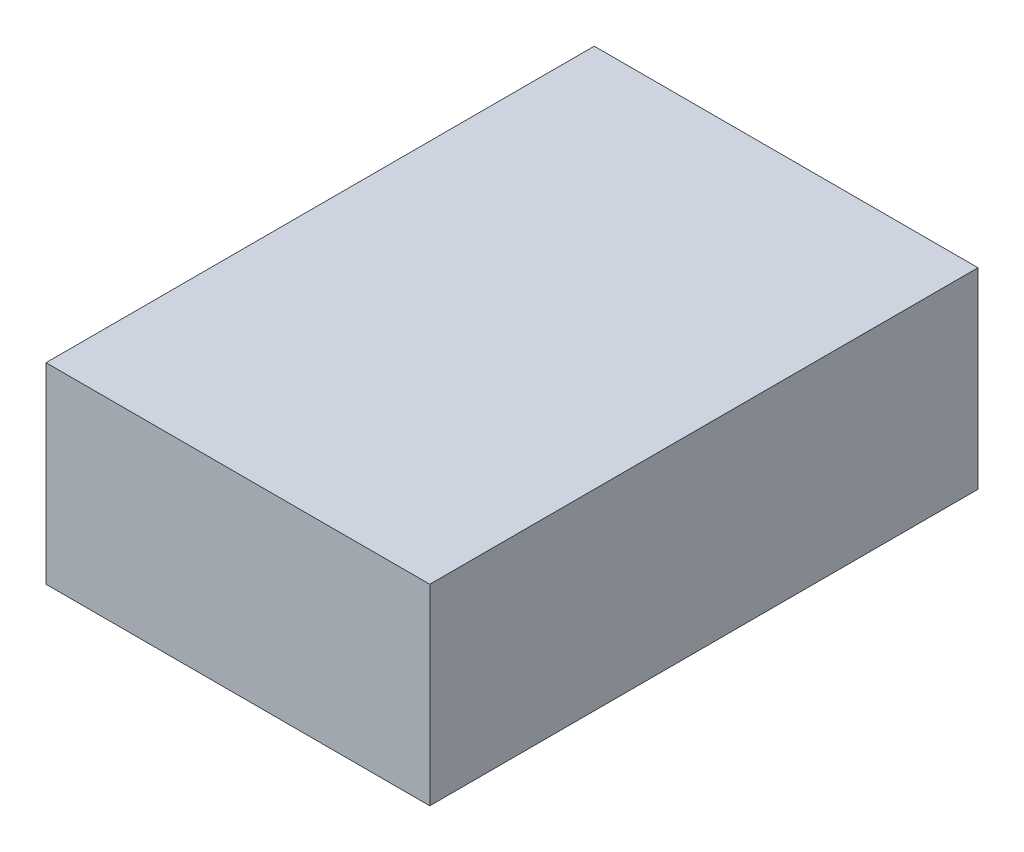
ISO-10303-21;
HEADER;
FILE_DESCRIPTION(('STEP AP214'),'2;1');
FILE_NAME('part.step','',(''),(''),'','','');
FILE_SCHEMA(('AUTOMOTIVE_DESIGN { 1 0 10303 214 1 1 1 1 }'));
ENDSEC;
DATA;
#1=APPLICATION_CONTEXT('core data for automotive mechanical design processes');
#2=APPLICATION_PROTOCOL_DEFINITION('international standard','automotive_design',2000,#1);
#3=PRODUCT_CONTEXT('',#1,'mechanical');
#4=PRODUCT('Part','Part','',(#3));
#5=PRODUCT_RELATED_PRODUCT_CATEGORY('part','',(#4));
#6=PRODUCT_DEFINITION_FORMATION('','',#4);
#7=PRODUCT_DEFINITION_CONTEXT('part definition',#1,'design');
#8=PRODUCT_DEFINITION('design','',#6,#7);
#9=PRODUCT_DEFINITION_SHAPE('','',#8);
#10=(LENGTH_UNIT() NAMED_UNIT(*) SI_UNIT(.MILLI.,.METRE.));
#11=(NAMED_UNIT(*) PLANE_ANGLE_UNIT() SI_UNIT($,.RADIAN.));
#12=(NAMED_UNIT(*) SI_UNIT($,.STERADIAN.) SOLID_ANGLE_UNIT());
#13=UNCERTAINTY_MEASURE_WITH_UNIT(LENGTH_MEASURE(1.E-05),#10,'distance_accuracy_value','');
#14=(GEOMETRIC_REPRESENTATION_CONTEXT(3) GLOBAL_UNCERTAINTY_ASSIGNED_CONTEXT((#13)) GLOBAL_UNIT_ASSIGNED_CONTEXT((#10,
#11,#12)) REPRESENTATION_CONTEXT('',''));
#15=CARTESIAN_POINT('',(0.,0.,0.));
#16=DIRECTION('',(0.,0.,1.));
#17=DIRECTION('',(1.,0.,0.));
#18=AXIS2_PLACEMENT_3D('',#15,#16,#17);
#19=CARTESIAN_POINT('',(70.,37.1150592216582,40.4399323181049));
#20=DIRECTION('',(0.,0.,-1.));
#21=DIRECTION('',(-1.,0.,0.));
#22=AXIS2_PLACEMENT_3D('',#19,#20,#21);
#23=PLANE('',#22);
#24=DIRECTION('',(0.,-1.,0.));
#25=VECTOR('',#24,1.);
#26=CARTESIAN_POINT('',(0.,37.1150592216582,40.4399323181049));
#27=LINE('',#26,#25);
#28=CARTESIAN_POINT('',(0.,37.1150592216582,40.4399323181049));
#29=VERTEX_POINT('',#28);
#30=CARTESIAN_POINT('',(0.,2.1150592216582,40.4399323181049));
#31=VERTEX_POINT('',#30);
#32=EDGE_CURVE('E100',#29,#31,#27,.T.);
#33=ORIENTED_EDGE('',*,*,#32,.T.);
#34=DIRECTION('',(-1.,0.,0.));
#35=VECTOR('',#34,1.);
#36=CARTESIAN_POINT('',(70.,2.1150592216582,40.4399323181049));
#37=LINE('',#36,#35);
#38=CARTESIAN_POINT('',(70.,2.1150592216582,40.4399323181049));
#39=VERTEX_POINT('',#38);
#40=EDGE_CURVE('E11',#39,#31,#37,.T.);
#41=ORIENTED_EDGE('',*,*,#40,.F.);
#42=DIRECTION('',(0.,-1.,0.));
#43=VECTOR('',#42,1.);
#44=CARTESIAN_POINT('',(70.,37.1150592216582,40.4399323181049));
#45=LINE('',#44,#43);
#46=CARTESIAN_POINT('',(70.,37.1150592216582,40.4399323181049));
#47=VERTEX_POINT('',#46);
#48=EDGE_CURVE('E88',#47,#39,#45,.T.);
#49=ORIENTED_EDGE('',*,*,#48,.F.);
#50=DIRECTION('',(-1.,0.,0.));
#51=VECTOR('',#50,1.);
#52=CARTESIAN_POINT('',(70.,37.1150592216582,40.4399323181049));
#53=LINE('',#52,#51);
#54=EDGE_CURVE('E96',#47,#29,#53,.T.);
#55=ORIENTED_EDGE('',*,*,#54,.T.);
#56=EDGE_LOOP('',(#33,#41,#49,#55));
#57=FACE_BOUND('',#56,.T.);
#58=ADVANCED_FACE('F37',(#57),#23,.F.);
#59=CARTESIAN_POINT('',(70.,2.1150592216582,40.4399323181049));
#60=DIRECTION('',(0.,1.,0.));
#61=DIRECTION('',(0.,0.,1.));
#62=AXIS2_PLACEMENT_3D('',#59,#60,#61);
#63=PLANE('',#62);
#64=DIRECTION('',(0.,0.,-1.));
#65=VECTOR('',#64,1.);
#66=CARTESIAN_POINT('',(0.,2.1150592216582,40.4399323181049));
#67=LINE('',#66,#65);
#68=CARTESIAN_POINT('',(0.,2.1150592216582,-59.5600676818951));
#69=VERTEX_POINT('',#68);
#70=EDGE_CURVE('E92',#31,#69,#67,.T.);
#71=ORIENTED_EDGE('',*,*,#70,.T.);
#72=DIRECTION('',(-1.,0.,0.));
#73=VECTOR('',#72,1.);
#74=CARTESIAN_POINT('',(70.,2.1150592216582,-59.5600676818951));
#75=LINE('',#74,#73);
#76=CARTESIAN_POINT('',(70.,2.1150592216582,-59.5600676818951));
#77=VERTEX_POINT('',#76);
#78=EDGE_CURVE('E45',#77,#69,#75,.T.);
#79=ORIENTED_EDGE('',*,*,#78,.F.);
#80=DIRECTION('',(0.,0.,-1.));
#81=VECTOR('',#80,1.);
#82=CARTESIAN_POINT('',(70.,2.1150592216582,40.4399323181049));
#83=LINE('',#82,#81);
#84=EDGE_CURVE('E83',#39,#77,#83,.T.);
#85=ORIENTED_EDGE('',*,*,#84,.F.);
#86=ORIENTED_EDGE('',*,*,#40,.T.);
#87=EDGE_LOOP('',(#71,#79,#85,#86));
#88=FACE_BOUND('',#87,.T.);
#89=ADVANCED_FACE('F91',(#88),#63,.F.);
#90=CARTESIAN_POINT('',(70.,37.1150592216582,-59.5600676818951));
#91=DIRECTION('',(0.,0.,1.));
#92=DIRECTION('',(0.,-1.,0.));
#93=AXIS2_PLACEMENT_3D('',#90,#91,#92);
#94=PLANE('',#93);
#95=DIRECTION('',(0.,1.,0.));
#96=VECTOR('',#95,1.);
#97=CARTESIAN_POINT('',(0.,37.1150592216582,-59.5600676818951));
#98=LINE('',#97,#96);
#99=CARTESIAN_POINT('',(0.,37.1150592216582,-59.5600676818951));
#100=VERTEX_POINT('',#99);
#101=EDGE_CURVE('E70',#69,#100,#98,.T.);
#102=ORIENTED_EDGE('',*,*,#101,.T.);
#103=DIRECTION('',(-1.,0.,0.));
#104=VECTOR('',#103,1.);
#105=CARTESIAN_POINT('',(70.,37.1150592216582,-59.5600676818951));
#106=LINE('',#105,#104);
#107=CARTESIAN_POINT('',(70.,37.1150592216582,-59.5600676818951));
#108=VERTEX_POINT('',#107);
#109=EDGE_CURVE('E93',#108,#100,#106,.T.);
#110=ORIENTED_EDGE('',*,*,#109,.F.);
#111=DIRECTION('',(0.,1.,0.));
#112=VECTOR('',#111,1.);
#113=CARTESIAN_POINT('',(70.,37.1150592216582,-59.5600676818951));
#114=LINE('',#113,#112);
#115=EDGE_CURVE('E86',#77,#108,#114,.T.);
#116=ORIENTED_EDGE('',*,*,#115,.F.);
#117=ORIENTED_EDGE('',*,*,#78,.T.);
#118=EDGE_LOOP('',(#102,#110,#116,#117));
#119=FACE_BOUND('',#118,.T.);
#120=ADVANCED_FACE('F94',(#119),#94,.F.);
#121=CARTESIAN_POINT('',(70.,37.1150592216582,40.4399323181049));
#122=DIRECTION('',(0.,-1.,0.));
#123=DIRECTION('',(0.,0.,-1.));
#124=AXIS2_PLACEMENT_3D('',#121,#122,#123);
#125=PLANE('',#124);
#126=DIRECTION('',(0.,0.,1.));
#127=VECTOR('',#126,1.);
#128=CARTESIAN_POINT('',(0.,37.1150592216582,40.4399323181049));
#129=LINE('',#128,#127);
#130=EDGE_CURVE('E76',#100,#29,#129,.T.);
#131=ORIENTED_EDGE('',*,*,#130,.T.);
#132=ORIENTED_EDGE('',*,*,#54,.F.);
#133=DIRECTION('',(0.,0.,1.));
#134=VECTOR('',#133,1.);
#135=CARTESIAN_POINT('',(70.,37.1150592216582,40.4399323181049));
#136=LINE('',#135,#134);
#137=EDGE_CURVE('E53',#108,#47,#136,.T.);
#138=ORIENTED_EDGE('',*,*,#137,.F.);
#139=ORIENTED_EDGE('',*,*,#109,.T.);
#140=EDGE_LOOP('',(#131,#132,#138,#139));
#141=FACE_BOUND('',#140,.T.);
#142=ADVANCED_FACE('F107',(#141),#125,.F.);
#143=CARTESIAN_POINT('',(70.,0.,0.));
#144=DIRECTION('',(1.,0.,0.));
#145=DIRECTION('',(0.,0.,-1.));
#146=AXIS2_PLACEMENT_3D('',#143,#144,#145);
#147=PLANE('',#146);
#148=ORIENTED_EDGE('',*,*,#48,.T.);
#149=ORIENTED_EDGE('',*,*,#84,.T.);
#150=ORIENTED_EDGE('',*,*,#115,.T.);
#151=ORIENTED_EDGE('',*,*,#137,.T.);
#152=EDGE_LOOP('',(#148,#149,#150,#151));
#153=FACE_BOUND('',#152,.T.);
#154=ADVANCED_FACE('F84',(#153),#147,.T.);
#155=CARTESIAN_POINT('',(0.,0.,0.));
#156=DIRECTION('',(1.,0.,0.));
#157=DIRECTION('',(0.,0.,-1.));
#158=AXIS2_PLACEMENT_3D('',#155,#156,#157);
#159=PLANE('',#158);
#160=ORIENTED_EDGE('',*,*,#32,.F.);
#161=ORIENTED_EDGE('',*,*,#130,.F.);
#162=ORIENTED_EDGE('',*,*,#101,.F.);
#163=ORIENTED_EDGE('',*,*,#70,.F.);
#164=EDGE_LOOP('',(#160,#161,#162,#163));
#165=FACE_BOUND('',#164,.T.);
#166=ADVANCED_FACE('F110',(#165),#159,.F.);
#167=CLOSED_SHELL('',(#58,#89,#120,#142,#154,#166));
#168=MANIFOLD_SOLID_BREP('B2',#167);
#169=ADVANCED_BREP_SHAPE_REPRESENTATION('',(#18,#168),#14);
#170=SHAPE_DEFINITION_REPRESENTATION(#9,#169);
ENDSEC;
END-ISO-10303-21;
